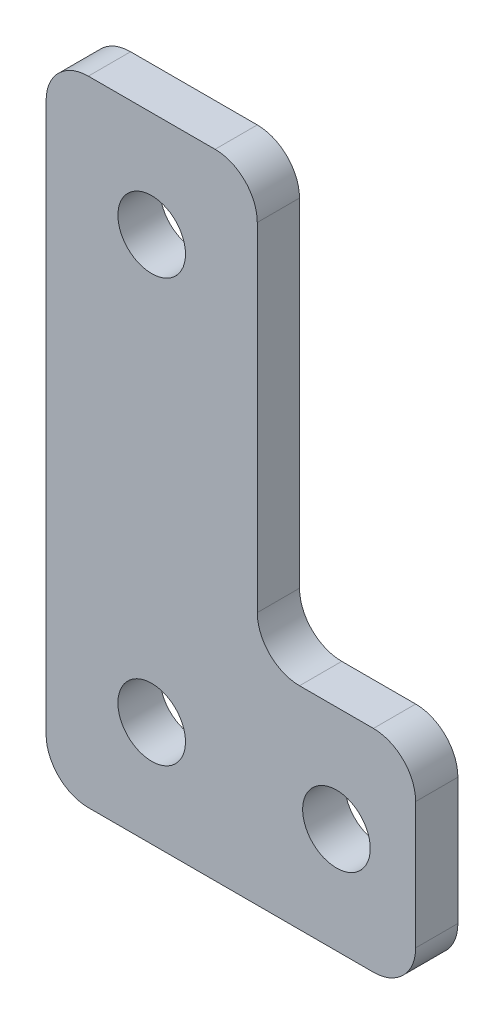
ISO-10303-21;
HEADER;
FILE_DESCRIPTION(('STEP AP214'),'2;1');
FILE_NAME('part.step','',(''),(''),'','','');
FILE_SCHEMA(('AUTOMOTIVE_DESIGN { 1 0 10303 214 1 1 1 1 }'));
ENDSEC;
DATA;
#1=APPLICATION_CONTEXT('core data for automotive mechanical design processes');
#2=APPLICATION_PROTOCOL_DEFINITION('international standard','automotive_design',2000,#1);
#3=PRODUCT_CONTEXT('',#1,'mechanical');
#4=PRODUCT('Part','Part','',(#3));
#5=PRODUCT_RELATED_PRODUCT_CATEGORY('part','',(#4));
#6=PRODUCT_DEFINITION_FORMATION('','',#4);
#7=PRODUCT_DEFINITION_CONTEXT('part definition',#1,'design');
#8=PRODUCT_DEFINITION('design','',#6,#7);
#9=PRODUCT_DEFINITION_SHAPE('','',#8);
#10=(LENGTH_UNIT() NAMED_UNIT(*) SI_UNIT(.MILLI.,.METRE.));
#11=(NAMED_UNIT(*) PLANE_ANGLE_UNIT() SI_UNIT($,.RADIAN.));
#12=(NAMED_UNIT(*) SI_UNIT($,.STERADIAN.) SOLID_ANGLE_UNIT());
#13=UNCERTAINTY_MEASURE_WITH_UNIT(LENGTH_MEASURE(1.E-05),#10,'distance_accuracy_value','');
#14=(GEOMETRIC_REPRESENTATION_CONTEXT(3) GLOBAL_UNCERTAINTY_ASSIGNED_CONTEXT((#13)) GLOBAL_UNIT_ASSIGNED_CONTEXT((#10,
#11,#12)) REPRESENTATION_CONTEXT('',''));
#15=CARTESIAN_POINT('',(0.,0.,0.));
#16=DIRECTION('',(0.,0.,1.));
#17=DIRECTION('',(1.,0.,0.));
#18=AXIS2_PLACEMENT_3D('',#15,#16,#17);
#19=CARTESIAN_POINT('',(0.,0.,2.));
#20=DIRECTION('',(0.,0.,-1.));
#21=DIRECTION('',(-1.,0.,0.));
#22=AXIS2_PLACEMENT_3D('',#19,#20,#21);
#23=PLANE('',#22);
#24=DIRECTION('',(0.,-1.,0.));
#25=VECTOR('',#24,1.);
#26=CARTESIAN_POINT('',(0.,0.,2.));
#27=LINE('',#26,#25);
#28=CARTESIAN_POINT('',(0.,28.,2.));
#29=VERTEX_POINT('',#28);
#30=CARTESIAN_POINT('',(0.,2.,2.));
#31=VERTEX_POINT('',#30);
#32=EDGE_CURVE('E170',#29,#31,#27,.T.);
#33=ORIENTED_EDGE('',*,*,#32,.T.);
#34=CARTESIAN_POINT('',(2.,2.,2.));
#35=DIRECTION('',(0.,0.,-1.));
#36=DIRECTION('',(-1.,0.,0.));
#37=AXIS2_PLACEMENT_3D('',#34,#35,#36);
#38=CIRCLE('',#37,2.);
#39=CARTESIAN_POINT('',(2.,0.,2.));
#40=VERTEX_POINT('',#39);
#41=EDGE_CURVE('E188',#31,#40,#38,.F.);
#42=ORIENTED_EDGE('',*,*,#41,.T.);
#43=DIRECTION('',(1.,0.,0.));
#44=VECTOR('',#43,1.);
#45=CARTESIAN_POINT('',(0.,0.,2.));
#46=LINE('',#45,#44);
#47=CARTESIAN_POINT('',(15.5,0.,2.));
#48=VERTEX_POINT('',#47);
#49=EDGE_CURVE('E145',#40,#48,#46,.T.);
#50=ORIENTED_EDGE('',*,*,#49,.T.);
#51=CARTESIAN_POINT('',(15.5,2.,2.));
#52=DIRECTION('',(0.,0.,-1.));
#53=DIRECTION('',(-1.,0.,0.));
#54=AXIS2_PLACEMENT_3D('',#51,#52,#53);
#55=CIRCLE('',#54,2.);
#56=CARTESIAN_POINT('',(17.5,2.,2.));
#57=VERTEX_POINT('',#56);
#58=EDGE_CURVE('E184',#48,#57,#55,.F.);
#59=ORIENTED_EDGE('',*,*,#58,.T.);
#60=DIRECTION('',(0.,1.,0.));
#61=VECTOR('',#60,1.);
#62=CARTESIAN_POINT('',(17.5,10.,2.));
#63=LINE('',#62,#61);
#64=CARTESIAN_POINT('',(17.5,8.,2.));
#65=VERTEX_POINT('',#64);
#66=EDGE_CURVE('E229',#57,#65,#63,.T.);
#67=ORIENTED_EDGE('',*,*,#66,.T.);
#68=CARTESIAN_POINT('',(15.5,8.,2.));
#69=DIRECTION('',(0.,0.,-1.));
#70=DIRECTION('',(-1.,0.,0.));
#71=AXIS2_PLACEMENT_3D('',#68,#69,#70);
#72=CIRCLE('',#71,2.);
#73=CARTESIAN_POINT('',(15.5,10.,2.));
#74=VERTEX_POINT('',#73);
#75=EDGE_CURVE('E182',#65,#74,#72,.F.);
#76=ORIENTED_EDGE('',*,*,#75,.T.);
#77=DIRECTION('',(-1.,0.,0.));
#78=VECTOR('',#77,1.);
#79=CARTESIAN_POINT('',(10.,10.,2.));
#80=LINE('',#79,#78);
#81=CARTESIAN_POINT('',(12.,10.,2.));
#82=VERTEX_POINT('',#81);
#83=EDGE_CURVE('E224',#74,#82,#80,.T.);
#84=ORIENTED_EDGE('',*,*,#83,.T.);
#85=CARTESIAN_POINT('',(12.,12.,2.));
#86=DIRECTION('',(0.,0.,-1.));
#87=DIRECTION('',(-1.,0.,0.));
#88=AXIS2_PLACEMENT_3D('',#85,#86,#87);
#89=CIRCLE('',#88,2.);
#90=CARTESIAN_POINT('',(10.,12.,2.));
#91=VERTEX_POINT('',#90);
#92=EDGE_CURVE('E11',#82,#91,#89,.T.);
#93=ORIENTED_EDGE('',*,*,#92,.T.);
#94=DIRECTION('',(0.,1.,0.));
#95=VECTOR('',#94,1.);
#96=CARTESIAN_POINT('',(10.,10.,2.));
#97=LINE('',#96,#95);
#98=CARTESIAN_POINT('',(10.,28.,2.));
#99=VERTEX_POINT('',#98);
#100=EDGE_CURVE('E223',#91,#99,#97,.T.);
#101=ORIENTED_EDGE('',*,*,#100,.T.);
#102=CARTESIAN_POINT('',(8.,28.,2.));
#103=DIRECTION('',(0.,0.,-1.));
#104=DIRECTION('',(-1.,0.,0.));
#105=AXIS2_PLACEMENT_3D('',#102,#103,#104);
#106=CIRCLE('',#105,2.);
#107=CARTESIAN_POINT('',(8.,30.,2.));
#108=VERTEX_POINT('',#107);
#109=EDGE_CURVE('E57',#99,#108,#106,.F.);
#110=ORIENTED_EDGE('',*,*,#109,.T.);
#111=DIRECTION('',(-1.,0.,0.));
#112=VECTOR('',#111,1.);
#113=CARTESIAN_POINT('',(0.,30.,2.));
#114=LINE('',#113,#112);
#115=CARTESIAN_POINT('',(2.,30.,2.));
#116=VERTEX_POINT('',#115);
#117=EDGE_CURVE('E171',#108,#116,#114,.T.);
#118=ORIENTED_EDGE('',*,*,#117,.T.);
#119=CARTESIAN_POINT('',(2.,28.,2.));
#120=DIRECTION('',(0.,0.,-1.));
#121=DIRECTION('',(-1.,0.,0.));
#122=AXIS2_PLACEMENT_3D('',#119,#120,#121);
#123=CIRCLE('',#122,2.);
#124=EDGE_CURVE('E186',#116,#29,#123,.F.);
#125=ORIENTED_EDGE('',*,*,#124,.T.);
#126=EDGE_LOOP('',(#33,#42,#50,#59,#67,#76,#84,#93,#101,#110,#118,#125));
#127=FACE_BOUND('',#126,.T.);
#128=CARTESIAN_POINT('',(5.,25.,2.));
#129=DIRECTION('',(0.,0.,1.));
#130=DIRECTION('',(1.,0.,0.));
#131=AXIS2_PLACEMENT_3D('',#128,#129,#130);
#132=CIRCLE('',#131,1.6);
#133=CARTESIAN_POINT('',(6.6,25.,2.));
#134=VERTEX_POINT('',#133);
#135=EDGE_CURVE('E159',#134,#134,#132,.T.);
#136=ORIENTED_EDGE('',*,*,#135,.F.);
#137=EDGE_LOOP('',(#136));
#138=FACE_BOUND('',#137,.T.);
#139=CARTESIAN_POINT('',(5.,5.,2.));
#140=DIRECTION('',(0.,0.,1.));
#141=DIRECTION('',(-1.,0.,0.));
#142=AXIS2_PLACEMENT_3D('',#139,#140,#141);
#143=CIRCLE('',#142,1.6);
#144=CARTESIAN_POINT('',(3.4,5.,2.));
#145=VERTEX_POINT('',#144);
#146=EDGE_CURVE('E239',#145,#145,#143,.T.);
#147=ORIENTED_EDGE('',*,*,#146,.F.);
#148=EDGE_LOOP('',(#147));
#149=FACE_BOUND('',#148,.T.);
#150=CARTESIAN_POINT('',(13.75,5.,2.));
#151=DIRECTION('',(0.,0.,1.));
#152=DIRECTION('',(1.,0.,0.));
#153=AXIS2_PLACEMENT_3D('',#150,#151,#152);
#154=CIRCLE('',#153,1.6);
#155=CARTESIAN_POINT('',(15.35,5.,2.));
#156=VERTEX_POINT('',#155);
#157=EDGE_CURVE('E245',#156,#156,#154,.T.);
#158=ORIENTED_EDGE('',*,*,#157,.F.);
#159=EDGE_LOOP('',(#158));
#160=FACE_BOUND('',#159,.T.);
#161=ADVANCED_FACE('F35',(#127,#138,#149,#160),#23,.F.);
#162=CARTESIAN_POINT('',(0.,0.,0.));
#163=DIRECTION('',(0.,0.,-1.));
#164=DIRECTION('',(-1.,0.,0.));
#165=AXIS2_PLACEMENT_3D('',#162,#163,#164);
#166=PLANE('',#165);
#167=CARTESIAN_POINT('',(5.,5.,0.));
#168=DIRECTION('',(0.,0.,1.));
#169=DIRECTION('',(-1.,0.,0.));
#170=AXIS2_PLACEMENT_3D('',#167,#168,#169);
#171=CIRCLE('',#170,1.6);
#172=CARTESIAN_POINT('',(3.4,5.,0.));
#173=VERTEX_POINT('',#172);
#174=EDGE_CURVE('E242',#173,#173,#171,.T.);
#175=ORIENTED_EDGE('',*,*,#174,.T.);
#176=EDGE_LOOP('',(#175));
#177=FACE_BOUND('',#176,.T.);
#178=DIRECTION('',(1.,0.,0.));
#179=VECTOR('',#178,1.);
#180=CARTESIAN_POINT('',(10.,0.,0.));
#181=LINE('',#180,#179);
#182=CARTESIAN_POINT('',(2.,0.,0.));
#183=VERTEX_POINT('',#182);
#184=CARTESIAN_POINT('',(15.5,0.,0.));
#185=VERTEX_POINT('',#184);
#186=EDGE_CURVE('E142',#183,#185,#181,.T.);
#187=ORIENTED_EDGE('',*,*,#186,.F.);
#188=CARTESIAN_POINT('',(2.,2.,0.));
#189=DIRECTION('',(0.,0.,-1.));
#190=DIRECTION('',(-1.,0.,0.));
#191=AXIS2_PLACEMENT_3D('',#188,#189,#190);
#192=CIRCLE('',#191,2.);
#193=CARTESIAN_POINT('',(0.,2.,0.));
#194=VERTEX_POINT('',#193);
#195=EDGE_CURVE('E125',#183,#194,#192,.T.);
#196=ORIENTED_EDGE('',*,*,#195,.T.);
#197=DIRECTION('',(0.,-1.,0.));
#198=VECTOR('',#197,1.);
#199=CARTESIAN_POINT('',(0.,0.,0.));
#200=LINE('',#199,#198);
#201=CARTESIAN_POINT('',(0.,28.,0.));
#202=VERTEX_POINT('',#201);
#203=EDGE_CURVE('E154',#202,#194,#200,.T.);
#204=ORIENTED_EDGE('',*,*,#203,.F.);
#205=CARTESIAN_POINT('',(2.,28.,0.));
#206=DIRECTION('',(0.,0.,-1.));
#207=DIRECTION('',(-1.,0.,0.));
#208=AXIS2_PLACEMENT_3D('',#205,#206,#207);
#209=CIRCLE('',#208,2.);
#210=CARTESIAN_POINT('',(2.,30.,0.));
#211=VERTEX_POINT('',#210);
#212=EDGE_CURVE('E136',#202,#211,#209,.T.);
#213=ORIENTED_EDGE('',*,*,#212,.T.);
#214=DIRECTION('',(-1.,0.,0.));
#215=VECTOR('',#214,1.);
#216=CARTESIAN_POINT('',(0.,30.,0.));
#217=LINE('',#216,#215);
#218=CARTESIAN_POINT('',(8.,30.,0.));
#219=VERTEX_POINT('',#218);
#220=EDGE_CURVE('E168',#219,#211,#217,.T.);
#221=ORIENTED_EDGE('',*,*,#220,.F.);
#222=CARTESIAN_POINT('',(8.,28.,0.));
#223=DIRECTION('',(0.,0.,-1.));
#224=DIRECTION('',(-1.,0.,0.));
#225=AXIS2_PLACEMENT_3D('',#222,#223,#224);
#226=CIRCLE('',#225,2.);
#227=CARTESIAN_POINT('',(10.,28.,0.));
#228=VERTEX_POINT('',#227);
#229=EDGE_CURVE('E146',#219,#228,#226,.T.);
#230=ORIENTED_EDGE('',*,*,#229,.T.);
#231=DIRECTION('',(0.,1.,0.));
#232=VECTOR('',#231,1.);
#233=CARTESIAN_POINT('',(10.,10.,0.));
#234=LINE('',#233,#232);
#235=CARTESIAN_POINT('',(10.,12.,0.));
#236=VERTEX_POINT('',#235);
#237=EDGE_CURVE('E165',#236,#228,#234,.T.);
#238=ORIENTED_EDGE('',*,*,#237,.F.);
#239=CARTESIAN_POINT('',(12.,12.,0.));
#240=DIRECTION('',(0.,0.,-1.));
#241=DIRECTION('',(-1.,0.,0.));
#242=AXIS2_PLACEMENT_3D('',#239,#240,#241);
#243=CIRCLE('',#242,2.);
#244=CARTESIAN_POINT('',(12.,10.,0.));
#245=VERTEX_POINT('',#244);
#246=EDGE_CURVE('E43',#236,#245,#243,.F.);
#247=ORIENTED_EDGE('',*,*,#246,.T.);
#248=DIRECTION('',(-1.,0.,0.));
#249=VECTOR('',#248,1.);
#250=CARTESIAN_POINT('',(10.,10.,0.));
#251=LINE('',#250,#249);
#252=CARTESIAN_POINT('',(15.5,10.,0.));
#253=VERTEX_POINT('',#252);
#254=EDGE_CURVE('E157',#253,#245,#251,.T.);
#255=ORIENTED_EDGE('',*,*,#254,.F.);
#256=CARTESIAN_POINT('',(15.5,8.,0.));
#257=DIRECTION('',(0.,0.,-1.));
#258=DIRECTION('',(-1.,0.,0.));
#259=AXIS2_PLACEMENT_3D('',#256,#257,#258);
#260=CIRCLE('',#259,2.);
#261=CARTESIAN_POINT('',(17.5,8.,0.));
#262=VERTEX_POINT('',#261);
#263=EDGE_CURVE('E174',#253,#262,#260,.T.);
#264=ORIENTED_EDGE('',*,*,#263,.T.);
#265=DIRECTION('',(0.,1.,0.));
#266=VECTOR('',#265,1.);
#267=CARTESIAN_POINT('',(17.5,10.,0.));
#268=LINE('',#267,#266);
#269=CARTESIAN_POINT('',(17.5,2.,0.));
#270=VERTEX_POINT('',#269);
#271=EDGE_CURVE('E153',#270,#262,#268,.T.);
#272=ORIENTED_EDGE('',*,*,#271,.F.);
#273=CARTESIAN_POINT('',(15.5,2.,0.));
#274=DIRECTION('',(0.,0.,-1.));
#275=DIRECTION('',(-1.,0.,0.));
#276=AXIS2_PLACEMENT_3D('',#273,#274,#275);
#277=CIRCLE('',#276,2.);
#278=EDGE_CURVE('E152',#270,#185,#277,.T.);
#279=ORIENTED_EDGE('',*,*,#278,.T.);
#280=EDGE_LOOP('',(#187,#196,#204,#213,#221,#230,#238,#247,#255,#264,#272,#279));
#281=FACE_BOUND('',#280,.T.);
#282=CARTESIAN_POINT('',(5.,25.,0.));
#283=DIRECTION('',(0.,0.,1.));
#284=DIRECTION('',(1.,0.,0.));
#285=AXIS2_PLACEMENT_3D('',#282,#283,#284);
#286=CIRCLE('',#285,1.6);
#287=CARTESIAN_POINT('',(6.6,25.,0.));
#288=VERTEX_POINT('',#287);
#289=EDGE_CURVE('E236',#288,#288,#286,.T.);
#290=ORIENTED_EDGE('',*,*,#289,.T.);
#291=EDGE_LOOP('',(#290));
#292=FACE_BOUND('',#291,.T.);
#293=CARTESIAN_POINT('',(13.75,5.,0.));
#294=DIRECTION('',(0.,0.,1.));
#295=DIRECTION('',(1.,0.,0.));
#296=AXIS2_PLACEMENT_3D('',#293,#294,#295);
#297=CIRCLE('',#296,1.6);
#298=CARTESIAN_POINT('',(15.35,5.,0.));
#299=VERTEX_POINT('',#298);
#300=EDGE_CURVE('E248',#299,#299,#297,.T.);
#301=ORIENTED_EDGE('',*,*,#300,.T.);
#302=EDGE_LOOP('',(#301));
#303=FACE_BOUND('',#302,.T.);
#304=ADVANCED_FACE('F149',(#177,#281,#292,#303),#166,.T.);
#305=CARTESIAN_POINT('',(0.,0.,2.));
#306=DIRECTION('',(1.,0.,0.));
#307=DIRECTION('',(0.,1.,0.));
#308=AXIS2_PLACEMENT_3D('',#305,#306,#307);
#309=PLANE('',#308);
#310=ORIENTED_EDGE('',*,*,#203,.T.);
#311=DIRECTION('',(0.,0.,-1.));
#312=VECTOR('',#311,1.);
#313=CARTESIAN_POINT('',(0.,2.,2.));
#314=LINE('',#313,#312);
#315=EDGE_CURVE('E130',#194,#31,#314,.F.);
#316=ORIENTED_EDGE('',*,*,#315,.T.);
#317=ORIENTED_EDGE('',*,*,#32,.F.);
#318=DIRECTION('',(0.,0.,-1.));
#319=VECTOR('',#318,1.);
#320=CARTESIAN_POINT('',(0.,28.,2.));
#321=LINE('',#320,#319);
#322=EDGE_CURVE('E135',#29,#202,#321,.T.);
#323=ORIENTED_EDGE('',*,*,#322,.T.);
#324=EDGE_LOOP('',(#310,#316,#317,#323));
#325=FACE_BOUND('',#324,.T.);
#326=ADVANCED_FACE('F262',(#325),#309,.F.);
#327=CARTESIAN_POINT('',(10.,0.,2.));
#328=DIRECTION('',(0.,1.,0.));
#329=DIRECTION('',(0.,0.,1.));
#330=AXIS2_PLACEMENT_3D('',#327,#328,#329);
#331=PLANE('',#330);
#332=ORIENTED_EDGE('',*,*,#49,.F.);
#333=DIRECTION('',(0.,0.,-1.));
#334=VECTOR('',#333,1.);
#335=CARTESIAN_POINT('',(2.,0.,2.));
#336=LINE('',#335,#334);
#337=EDGE_CURVE('E129',#40,#183,#336,.T.);
#338=ORIENTED_EDGE('',*,*,#337,.T.);
#339=ORIENTED_EDGE('',*,*,#186,.T.);
#340=DIRECTION('',(0.,0.,-1.));
#341=VECTOR('',#340,1.);
#342=CARTESIAN_POINT('',(15.5,0.,2.));
#343=LINE('',#342,#341);
#344=EDGE_CURVE('E147',#185,#48,#343,.F.);
#345=ORIENTED_EDGE('',*,*,#344,.T.);
#346=EDGE_LOOP('',(#332,#338,#339,#345));
#347=FACE_BOUND('',#346,.T.);
#348=ADVANCED_FACE('F141',(#347),#331,.F.);
#349=CARTESIAN_POINT('',(17.5,10.,2.));
#350=DIRECTION('',(-1.,0.,0.));
#351=DIRECTION('',(0.,0.,1.));
#352=AXIS2_PLACEMENT_3D('',#349,#350,#351);
#353=PLANE('',#352);
#354=ORIENTED_EDGE('',*,*,#66,.F.);
#355=DIRECTION('',(0.,0.,-1.));
#356=VECTOR('',#355,1.);
#357=CARTESIAN_POINT('',(17.5,2.,2.));
#358=LINE('',#357,#356);
#359=EDGE_CURVE('E196',#57,#270,#358,.T.);
#360=ORIENTED_EDGE('',*,*,#359,.T.);
#361=ORIENTED_EDGE('',*,*,#271,.T.);
#362=DIRECTION('',(0.,0.,-1.));
#363=VECTOR('',#362,1.);
#364=CARTESIAN_POINT('',(17.5,8.,2.));
#365=LINE('',#364,#363);
#366=EDGE_CURVE('E194',#262,#65,#365,.F.);
#367=ORIENTED_EDGE('',*,*,#366,.T.);
#368=EDGE_LOOP('',(#354,#360,#361,#367));
#369=FACE_BOUND('',#368,.T.);
#370=ADVANCED_FACE('F276',(#369),#353,.F.);
#371=CARTESIAN_POINT('',(10.,10.,2.));
#372=DIRECTION('',(0.,-1.,0.));
#373=DIRECTION('',(0.,0.,-1.));
#374=AXIS2_PLACEMENT_3D('',#371,#372,#373);
#375=PLANE('',#374);
#376=ORIENTED_EDGE('',*,*,#83,.F.);
#377=DIRECTION('',(0.,0.,-1.));
#378=VECTOR('',#377,1.);
#379=CARTESIAN_POINT('',(15.5,10.,2.));
#380=LINE('',#379,#378);
#381=EDGE_CURVE('E201',#74,#253,#380,.T.);
#382=ORIENTED_EDGE('',*,*,#381,.T.);
#383=ORIENTED_EDGE('',*,*,#254,.T.);
#384=DIRECTION('',(0.,0.,-1.));
#385=VECTOR('',#384,1.);
#386=CARTESIAN_POINT('',(12.,10.,2.));
#387=LINE('',#386,#385);
#388=EDGE_CURVE('E199',#245,#82,#387,.F.);
#389=ORIENTED_EDGE('',*,*,#388,.T.);
#390=EDGE_LOOP('',(#376,#382,#383,#389));
#391=FACE_BOUND('',#390,.T.);
#392=ADVANCED_FACE('F215',(#391),#375,.F.);
#393=CARTESIAN_POINT('',(10.,10.,2.));
#394=DIRECTION('',(-1.,0.,0.));
#395=DIRECTION('',(0.,-1.,0.));
#396=AXIS2_PLACEMENT_3D('',#393,#394,#395);
#397=PLANE('',#396);
#398=ORIENTED_EDGE('',*,*,#100,.F.);
#399=DIRECTION('',(0.,0.,-1.));
#400=VECTOR('',#399,1.);
#401=CARTESIAN_POINT('',(10.,12.,0.));
#402=LINE('',#401,#400);
#403=EDGE_CURVE('E206',#91,#236,#402,.T.);
#404=ORIENTED_EDGE('',*,*,#403,.T.);
#405=ORIENTED_EDGE('',*,*,#237,.T.);
#406=DIRECTION('',(0.,0.,-1.));
#407=VECTOR('',#406,1.);
#408=CARTESIAN_POINT('',(10.,28.,2.));
#409=LINE('',#408,#407);
#410=EDGE_CURVE('E204',#228,#99,#409,.F.);
#411=ORIENTED_EDGE('',*,*,#410,.T.);
#412=EDGE_LOOP('',(#398,#404,#405,#411));
#413=FACE_BOUND('',#412,.T.);
#414=ADVANCED_FACE('F226',(#413),#397,.F.);
#415=CARTESIAN_POINT('',(0.,30.,2.));
#416=DIRECTION('',(0.,-1.,0.));
#417=DIRECTION('',(0.,0.,-1.));
#418=AXIS2_PLACEMENT_3D('',#415,#416,#417);
#419=PLANE('',#418);
#420=ORIENTED_EDGE('',*,*,#220,.T.);
#421=DIRECTION('',(0.,0.,-1.));
#422=VECTOR('',#421,1.);
#423=CARTESIAN_POINT('',(2.,30.,2.));
#424=LINE('',#423,#422);
#425=EDGE_CURVE('E50',#211,#116,#424,.F.);
#426=ORIENTED_EDGE('',*,*,#425,.T.);
#427=ORIENTED_EDGE('',*,*,#117,.F.);
#428=DIRECTION('',(0.,0.,-1.));
#429=VECTOR('',#428,1.);
#430=CARTESIAN_POINT('',(8.,30.,2.));
#431=LINE('',#430,#429);
#432=EDGE_CURVE('E190',#108,#219,#431,.T.);
#433=ORIENTED_EDGE('',*,*,#432,.T.);
#434=EDGE_LOOP('',(#420,#426,#427,#433));
#435=FACE_BOUND('',#434,.T.);
#436=ADVANCED_FACE('F269',(#435),#419,.F.);
#437=CARTESIAN_POINT('',(5.,25.,2.));
#438=DIRECTION('',(0.,0.,-1.));
#439=DIRECTION('',(-1.,0.,0.));
#440=AXIS2_PLACEMENT_3D('',#437,#438,#439);
#441=CYLINDRICAL_SURFACE('',#440,1.6);
#442=ORIENTED_EDGE('',*,*,#135,.T.);
#443=EDGE_LOOP('',(#442));
#444=FACE_BOUND('',#443,.T.);
#445=ORIENTED_EDGE('',*,*,#289,.F.);
#446=EDGE_LOOP('',(#445));
#447=FACE_BOUND('',#446,.T.);
#448=ADVANCED_FACE('F266',(#444,#447),#441,.F.);
#449=CARTESIAN_POINT('',(5.,5.,2.));
#450=DIRECTION('',(0.,0.,-1.));
#451=DIRECTION('',(-1.,0.,0.));
#452=AXIS2_PLACEMENT_3D('',#449,#450,#451);
#453=CYLINDRICAL_SURFACE('',#452,1.6);
#454=ORIENTED_EDGE('',*,*,#146,.T.);
#455=EDGE_LOOP('',(#454));
#456=FACE_BOUND('',#455,.T.);
#457=ORIENTED_EDGE('',*,*,#174,.F.);
#458=EDGE_LOOP('',(#457));
#459=FACE_BOUND('',#458,.T.);
#460=ADVANCED_FACE('F401',(#456,#459),#453,.F.);
#461=CARTESIAN_POINT('',(13.75,5.,2.));
#462=DIRECTION('',(0.,0.,-1.));
#463=DIRECTION('',(-1.,0.,0.));
#464=AXIS2_PLACEMENT_3D('',#461,#462,#463);
#465=CYLINDRICAL_SURFACE('',#464,1.6);
#466=ORIENTED_EDGE('',*,*,#157,.T.);
#467=EDGE_LOOP('',(#466));
#468=FACE_BOUND('',#467,.T.);
#469=ORIENTED_EDGE('',*,*,#300,.F.);
#470=EDGE_LOOP('',(#469));
#471=FACE_BOUND('',#470,.T.);
#472=ADVANCED_FACE('F254',(#468,#471),#465,.F.);
#473=CARTESIAN_POINT('',(2.,2.,2.));
#474=DIRECTION('',(0.,0.,-1.));
#475=DIRECTION('',(-1.,0.,0.));
#476=AXIS2_PLACEMENT_3D('',#473,#474,#475);
#477=CYLINDRICAL_SURFACE('',#476,2.);
#478=ORIENTED_EDGE('',*,*,#41,.F.);
#479=ORIENTED_EDGE('',*,*,#315,.F.);
#480=ORIENTED_EDGE('',*,*,#195,.F.);
#481=ORIENTED_EDGE('',*,*,#337,.F.);
#482=EDGE_LOOP('',(#478,#479,#480,#481));
#483=FACE_BOUND('',#482,.T.);
#484=ADVANCED_FACE('F128',(#483),#477,.T.);
#485=CARTESIAN_POINT('',(2.,28.,2.));
#486=DIRECTION('',(0.,0.,-1.));
#487=DIRECTION('',(-1.,0.,0.));
#488=AXIS2_PLACEMENT_3D('',#485,#486,#487);
#489=CYLINDRICAL_SURFACE('',#488,2.);
#490=ORIENTED_EDGE('',*,*,#124,.F.);
#491=ORIENTED_EDGE('',*,*,#425,.F.);
#492=ORIENTED_EDGE('',*,*,#212,.F.);
#493=ORIENTED_EDGE('',*,*,#322,.F.);
#494=EDGE_LOOP('',(#490,#491,#492,#493));
#495=FACE_BOUND('',#494,.T.);
#496=ADVANCED_FACE('F287',(#495),#489,.T.);
#497=CARTESIAN_POINT('',(15.5,2.,2.));
#498=DIRECTION('',(0.,0.,-1.));
#499=DIRECTION('',(-1.,0.,0.));
#500=AXIS2_PLACEMENT_3D('',#497,#498,#499);
#501=CYLINDRICAL_SURFACE('',#500,2.);
#502=ORIENTED_EDGE('',*,*,#58,.F.);
#503=ORIENTED_EDGE('',*,*,#344,.F.);
#504=ORIENTED_EDGE('',*,*,#278,.F.);
#505=ORIENTED_EDGE('',*,*,#359,.F.);
#506=EDGE_LOOP('',(#502,#503,#504,#505));
#507=FACE_BOUND('',#506,.T.);
#508=ADVANCED_FACE('F290',(#507),#501,.T.);
#509=CARTESIAN_POINT('',(15.5,8.,2.));
#510=DIRECTION('',(0.,0.,-1.));
#511=DIRECTION('',(-1.,0.,0.));
#512=AXIS2_PLACEMENT_3D('',#509,#510,#511);
#513=CYLINDRICAL_SURFACE('',#512,2.);
#514=ORIENTED_EDGE('',*,*,#75,.F.);
#515=ORIENTED_EDGE('',*,*,#366,.F.);
#516=ORIENTED_EDGE('',*,*,#263,.F.);
#517=ORIENTED_EDGE('',*,*,#381,.F.);
#518=EDGE_LOOP('',(#514,#515,#516,#517));
#519=FACE_BOUND('',#518,.T.);
#520=ADVANCED_FACE('F294',(#519),#513,.T.);
#521=CARTESIAN_POINT('',(12.,12.,2.));
#522=DIRECTION('',(0.,0.,1.));
#523=DIRECTION('',(1.,0.,0.));
#524=AXIS2_PLACEMENT_3D('',#521,#522,#523);
#525=CYLINDRICAL_SURFACE('',#524,2.);
#526=ORIENTED_EDGE('',*,*,#92,.F.);
#527=ORIENTED_EDGE('',*,*,#388,.F.);
#528=ORIENTED_EDGE('',*,*,#246,.F.);
#529=ORIENTED_EDGE('',*,*,#403,.F.);
#530=EDGE_LOOP('',(#526,#527,#528,#529));
#531=FACE_BOUND('',#530,.T.);
#532=ADVANCED_FACE('F219',(#531),#525,.F.);
#533=CARTESIAN_POINT('',(8.,28.,2.));
#534=DIRECTION('',(0.,0.,-1.));
#535=DIRECTION('',(-1.,0.,0.));
#536=AXIS2_PLACEMENT_3D('',#533,#534,#535);
#537=CYLINDRICAL_SURFACE('',#536,2.);
#538=ORIENTED_EDGE('',*,*,#109,.F.);
#539=ORIENTED_EDGE('',*,*,#410,.F.);
#540=ORIENTED_EDGE('',*,*,#229,.F.);
#541=ORIENTED_EDGE('',*,*,#432,.F.);
#542=EDGE_LOOP('',(#538,#539,#540,#541));
#543=FACE_BOUND('',#542,.T.);
#544=ADVANCED_FACE('F37',(#543),#537,.T.);
#545=CLOSED_SHELL('',(#161,#304,#326,#348,#370,#392,#414,#436,#448,#460,#472,#484,#496,#508,
#520,#532,#544));
#546=MANIFOLD_SOLID_BREP('B2',#545);
#547=ADVANCED_BREP_SHAPE_REPRESENTATION('',(#18,#546),#14);
#548=SHAPE_DEFINITION_REPRESENTATION(#9,#547);
ENDSEC;
END-ISO-10303-21;
